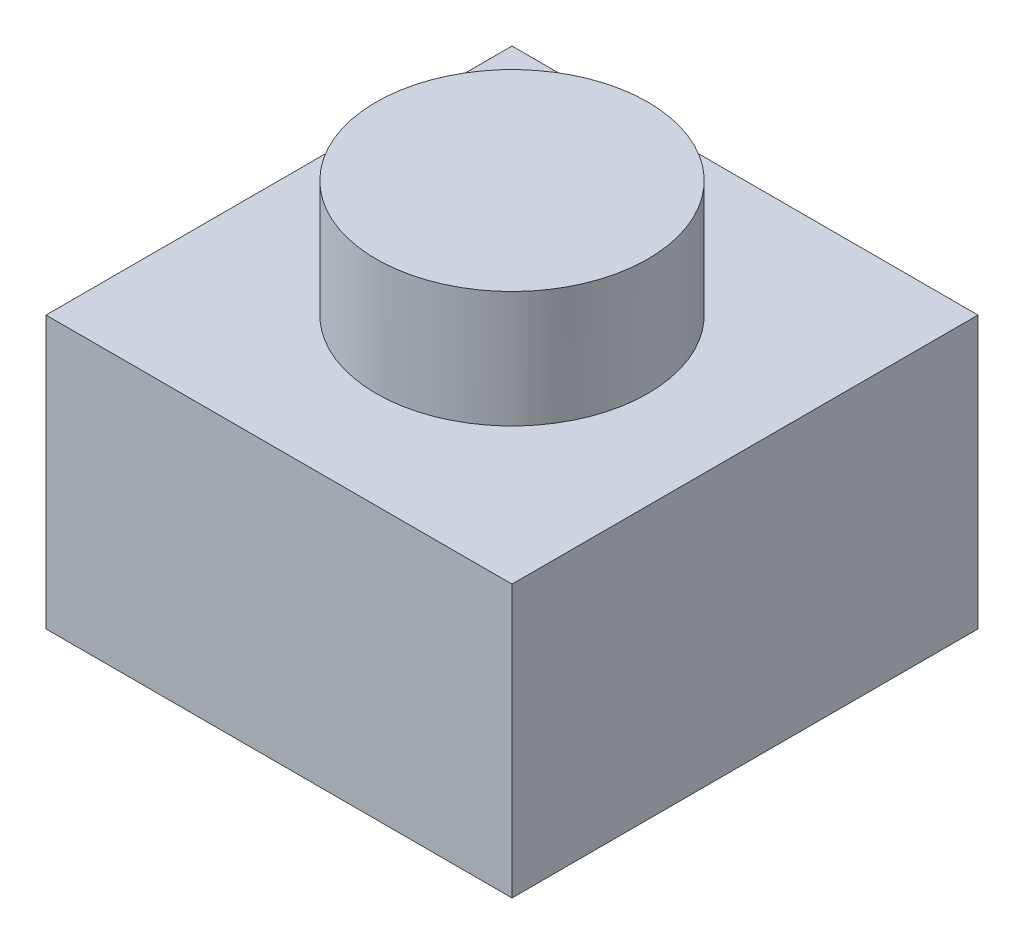
ISO-10303-21;
HEADER;
FILE_DESCRIPTION(('STEP AP214'),'2;1');
FILE_NAME('part.step','',(''),(''),'','','');
FILE_SCHEMA(('AUTOMOTIVE_DESIGN { 1 0 10303 214 1 1 1 1 }'));
ENDSEC;
DATA;
#1=APPLICATION_CONTEXT('core data for automotive mechanical design processes');
#2=APPLICATION_PROTOCOL_DEFINITION('international standard','automotive_design',2000,#1);
#3=PRODUCT_CONTEXT('',#1,'mechanical');
#4=PRODUCT('Part','Part','',(#3));
#5=PRODUCT_RELATED_PRODUCT_CATEGORY('part','',(#4));
#6=PRODUCT_DEFINITION_FORMATION('','',#4);
#7=PRODUCT_DEFINITION_CONTEXT('part definition',#1,'design');
#8=PRODUCT_DEFINITION('design','',#6,#7);
#9=PRODUCT_DEFINITION_SHAPE('','',#8);
#10=(LENGTH_UNIT() NAMED_UNIT(*) SI_UNIT(.MILLI.,.METRE.));
#11=(NAMED_UNIT(*) PLANE_ANGLE_UNIT() SI_UNIT($,.RADIAN.));
#12=(NAMED_UNIT(*) SI_UNIT($,.STERADIAN.) SOLID_ANGLE_UNIT());
#13=UNCERTAINTY_MEASURE_WITH_UNIT(LENGTH_MEASURE(1.E-05),#10,'distance_accuracy_value','');
#14=(GEOMETRIC_REPRESENTATION_CONTEXT(3) GLOBAL_UNCERTAINTY_ASSIGNED_CONTEXT((#13)) GLOBAL_UNIT_ASSIGNED_CONTEXT((#10,
#11,#12)) REPRESENTATION_CONTEXT('',''));
#15=CARTESIAN_POINT('',(0.,0.,0.));
#16=DIRECTION('',(0.,0.,1.));
#17=DIRECTION('',(1.,0.,0.));
#18=AXIS2_PLACEMENT_3D('',#15,#16,#17);
#19=CARTESIAN_POINT('',(3.,3.5,-3.));
#20=DIRECTION('',(-1.,0.,0.));
#21=DIRECTION('',(0.,0.,1.));
#22=AXIS2_PLACEMENT_3D('',#19,#20,#21);
#23=PLANE('',#22);
#24=DIRECTION('',(0.,0.,-1.));
#25=VECTOR('',#24,1.);
#26=CARTESIAN_POINT('',(3.,0.,-3.));
#27=LINE('',#26,#25);
#28=CARTESIAN_POINT('',(3.,0.,3.));
#29=VERTEX_POINT('',#28);
#30=CARTESIAN_POINT('',(3.,0.,-3.));
#31=VERTEX_POINT('',#30);
#32=EDGE_CURVE('E98',#29,#31,#27,.T.);
#33=ORIENTED_EDGE('',*,*,#32,.T.);
#34=DIRECTION('',(0.,-1.,0.));
#35=VECTOR('',#34,1.);
#36=CARTESIAN_POINT('',(3.,3.5,-3.));
#37=LINE('',#36,#35);
#38=CARTESIAN_POINT('',(3.,3.5,-3.));
#39=VERTEX_POINT('',#38);
#40=EDGE_CURVE('E35',#39,#31,#37,.T.);
#41=ORIENTED_EDGE('',*,*,#40,.F.);
#42=DIRECTION('',(0.,0.,-1.));
#43=VECTOR('',#42,1.);
#44=CARTESIAN_POINT('',(3.,3.5,-3.));
#45=LINE('',#44,#43);
#46=CARTESIAN_POINT('',(3.,3.5,3.));
#47=VERTEX_POINT('',#46);
#48=EDGE_CURVE('E85',#47,#39,#45,.T.);
#49=ORIENTED_EDGE('',*,*,#48,.F.);
#50=DIRECTION('',(0.,-1.,0.));
#51=VECTOR('',#50,1.);
#52=CARTESIAN_POINT('',(3.,3.5,3.));
#53=LINE('',#52,#51);
#54=EDGE_CURVE('E94',#47,#29,#53,.T.);
#55=ORIENTED_EDGE('',*,*,#54,.T.);
#56=EDGE_LOOP('',(#33,#41,#49,#55));
#57=FACE_BOUND('',#56,.T.);
#58=ADVANCED_FACE('F32',(#57),#23,.F.);
#59=CARTESIAN_POINT('',(-3.,3.5,-3.));
#60=DIRECTION('',(0.,0.,1.));
#61=DIRECTION('',(1.,0.,0.));
#62=AXIS2_PLACEMENT_3D('',#59,#60,#61);
#63=PLANE('',#62);
#64=DIRECTION('',(-1.,0.,0.));
#65=VECTOR('',#64,1.);
#66=CARTESIAN_POINT('',(-3.,0.,-3.));
#67=LINE('',#66,#65);
#68=CARTESIAN_POINT('',(-3.,0.,-3.));
#69=VERTEX_POINT('',#68);
#70=EDGE_CURVE('E90',#31,#69,#67,.T.);
#71=ORIENTED_EDGE('',*,*,#70,.T.);
#72=DIRECTION('',(0.,-1.,0.));
#73=VECTOR('',#72,1.);
#74=CARTESIAN_POINT('',(-3.,3.5,-3.));
#75=LINE('',#74,#73);
#76=CARTESIAN_POINT('',(-3.,3.5,-3.));
#77=VERTEX_POINT('',#76);
#78=EDGE_CURVE('E88',#77,#69,#75,.T.);
#79=ORIENTED_EDGE('',*,*,#78,.F.);
#80=DIRECTION('',(-1.,0.,0.));
#81=VECTOR('',#80,1.);
#82=CARTESIAN_POINT('',(-3.,3.5,-3.));
#83=LINE('',#82,#81);
#84=EDGE_CURVE('E80',#39,#77,#83,.T.);
#85=ORIENTED_EDGE('',*,*,#84,.F.);
#86=ORIENTED_EDGE('',*,*,#40,.T.);
#87=EDGE_LOOP('',(#71,#79,#85,#86));
#88=FACE_BOUND('',#87,.T.);
#89=ADVANCED_FACE('F89',(#88),#63,.F.);
#90=CARTESIAN_POINT('',(-3.,3.5,-3.));
#91=DIRECTION('',(1.,0.,0.));
#92=DIRECTION('',(0.,0.,-1.));
#93=AXIS2_PLACEMENT_3D('',#90,#91,#92);
#94=PLANE('',#93);
#95=DIRECTION('',(0.,0.,1.));
#96=VECTOR('',#95,1.);
#97=CARTESIAN_POINT('',(-3.,0.,-3.));
#98=LINE('',#97,#96);
#99=CARTESIAN_POINT('',(-3.,0.,3.));
#100=VERTEX_POINT('',#99);
#101=EDGE_CURVE('E66',#69,#100,#98,.T.);
#102=ORIENTED_EDGE('',*,*,#101,.T.);
#103=DIRECTION('',(0.,-1.,0.));
#104=VECTOR('',#103,1.);
#105=CARTESIAN_POINT('',(-3.,3.5,3.));
#106=LINE('',#105,#104);
#107=CARTESIAN_POINT('',(-3.,3.5,3.));
#108=VERTEX_POINT('',#107);
#109=EDGE_CURVE('E91',#108,#100,#106,.T.);
#110=ORIENTED_EDGE('',*,*,#109,.F.);
#111=DIRECTION('',(0.,0.,1.));
#112=VECTOR('',#111,1.);
#113=CARTESIAN_POINT('',(-3.,3.5,-3.));
#114=LINE('',#113,#112);
#115=EDGE_CURVE('E83',#77,#108,#114,.T.);
#116=ORIENTED_EDGE('',*,*,#115,.F.);
#117=ORIENTED_EDGE('',*,*,#78,.T.);
#118=EDGE_LOOP('',(#102,#110,#116,#117));
#119=FACE_BOUND('',#118,.T.);
#120=ADVANCED_FACE('F92',(#119),#94,.F.);
#121=CARTESIAN_POINT('',(-3.,3.5,3.));
#122=DIRECTION('',(0.,0.,-1.));
#123=DIRECTION('',(-1.,0.,0.));
#124=AXIS2_PLACEMENT_3D('',#121,#122,#123);
#125=PLANE('',#124);
#126=DIRECTION('',(1.,0.,0.));
#127=VECTOR('',#126,1.);
#128=CARTESIAN_POINT('',(-3.,0.,3.));
#129=LINE('',#128,#127);
#130=EDGE_CURVE('E72',#100,#29,#129,.T.);
#131=ORIENTED_EDGE('',*,*,#130,.T.);
#132=ORIENTED_EDGE('',*,*,#54,.F.);
#133=DIRECTION('',(1.,0.,0.));
#134=VECTOR('',#133,1.);
#135=CARTESIAN_POINT('',(-3.,3.5,3.));
#136=LINE('',#135,#134);
#137=EDGE_CURVE('E49',#108,#47,#136,.T.);
#138=ORIENTED_EDGE('',*,*,#137,.F.);
#139=ORIENTED_EDGE('',*,*,#109,.T.);
#140=EDGE_LOOP('',(#131,#132,#138,#139));
#141=FACE_BOUND('',#140,.T.);
#142=ADVANCED_FACE('F106',(#141),#125,.F.);
#143=CARTESIAN_POINT('',(0.,3.5,0.));
#144=DIRECTION('',(0.,1.,0.));
#145=DIRECTION('',(0.,0.,1.));
#146=AXIS2_PLACEMENT_3D('',#143,#144,#145);
#147=PLANE('',#146);
#148=CARTESIAN_POINT('',(0.,3.5,0.));
#149=DIRECTION('',(0.,1.,0.));
#150=DIRECTION('',(0.,0.,1.));
#151=AXIS2_PLACEMENT_3D('',#148,#149,#150);
#152=CIRCLE('',#151,1.75);
#153=CARTESIAN_POINT('',(0.,3.5,1.75));
#154=VERTEX_POINT('',#153);
#155=EDGE_CURVE('E11',#154,#154,#152,.T.);
#156=ORIENTED_EDGE('',*,*,#155,.F.);
#157=EDGE_LOOP('',(#156));
#158=FACE_BOUND('',#157,.T.);
#159=ORIENTED_EDGE('',*,*,#48,.T.);
#160=ORIENTED_EDGE('',*,*,#84,.T.);
#161=ORIENTED_EDGE('',*,*,#115,.T.);
#162=ORIENTED_EDGE('',*,*,#137,.T.);
#163=EDGE_LOOP('',(#159,#160,#161,#162));
#164=FACE_BOUND('',#163,.T.);
#165=ADVANCED_FACE('F81',(#158,#164),#147,.T.);
#166=CARTESIAN_POINT('',(0.,0.,0.));
#167=DIRECTION('',(0.,1.,0.));
#168=DIRECTION('',(0.,0.,1.));
#169=AXIS2_PLACEMENT_3D('',#166,#167,#168);
#170=PLANE('',#169);
#171=ORIENTED_EDGE('',*,*,#32,.F.);
#172=ORIENTED_EDGE('',*,*,#130,.F.);
#173=ORIENTED_EDGE('',*,*,#101,.F.);
#174=ORIENTED_EDGE('',*,*,#70,.F.);
#175=EDGE_LOOP('',(#171,#172,#173,#174));
#176=FACE_BOUND('',#175,.T.);
#177=ADVANCED_FACE('F109',(#176),#170,.F.);
#178=CARTESIAN_POINT('',(0.,5.,0.));
#179=DIRECTION('',(0.,-1.,0.));
#180=DIRECTION('',(0.,0.,-1.));
#181=AXIS2_PLACEMENT_3D('',#178,#179,#180);
#182=CYLINDRICAL_SURFACE('',#181,1.75);
#183=ORIENTED_EDGE('',*,*,#155,.T.);
#184=EDGE_LOOP('',(#183));
#185=FACE_BOUND('',#184,.T.);
#186=CARTESIAN_POINT('',(0.,5.,0.));
#187=DIRECTION('',(0.,-1.,0.));
#188=DIRECTION('',(0.,0.,-1.));
#189=AXIS2_PLACEMENT_3D('',#186,#187,#188);
#190=CIRCLE('',#189,1.75);
#191=CARTESIAN_POINT('',(0.,5.,-1.75));
#192=VERTEX_POINT('',#191);
#193=EDGE_CURVE('E101',#192,#192,#190,.T.);
#194=ORIENTED_EDGE('',*,*,#193,.T.);
#195=EDGE_LOOP('',(#194));
#196=FACE_BOUND('',#195,.T.);
#197=ADVANCED_FACE('F115',(#185,#196),#182,.T.);
#198=CARTESIAN_POINT('',(0.,5.,0.));
#199=DIRECTION('',(0.,-1.,0.));
#200=DIRECTION('',(0.,0.,-1.));
#201=AXIS2_PLACEMENT_3D('',#198,#199,#200);
#202=PLANE('',#201);
#203=ORIENTED_EDGE('',*,*,#193,.F.);
#204=EDGE_LOOP('',(#203));
#205=FACE_BOUND('',#204,.T.);
#206=ADVANCED_FACE('F117',(#205),#202,.F.);
#207=CLOSED_SHELL('',(#58,#89,#120,#142,#165,#177,#197,#206));
#208=MANIFOLD_SOLID_BREP('B2',#207);
#209=ADVANCED_BREP_SHAPE_REPRESENTATION('',(#18,#208),#14);
#210=SHAPE_DEFINITION_REPRESENTATION(#9,#209);
ENDSEC;
END-ISO-10303-21;
